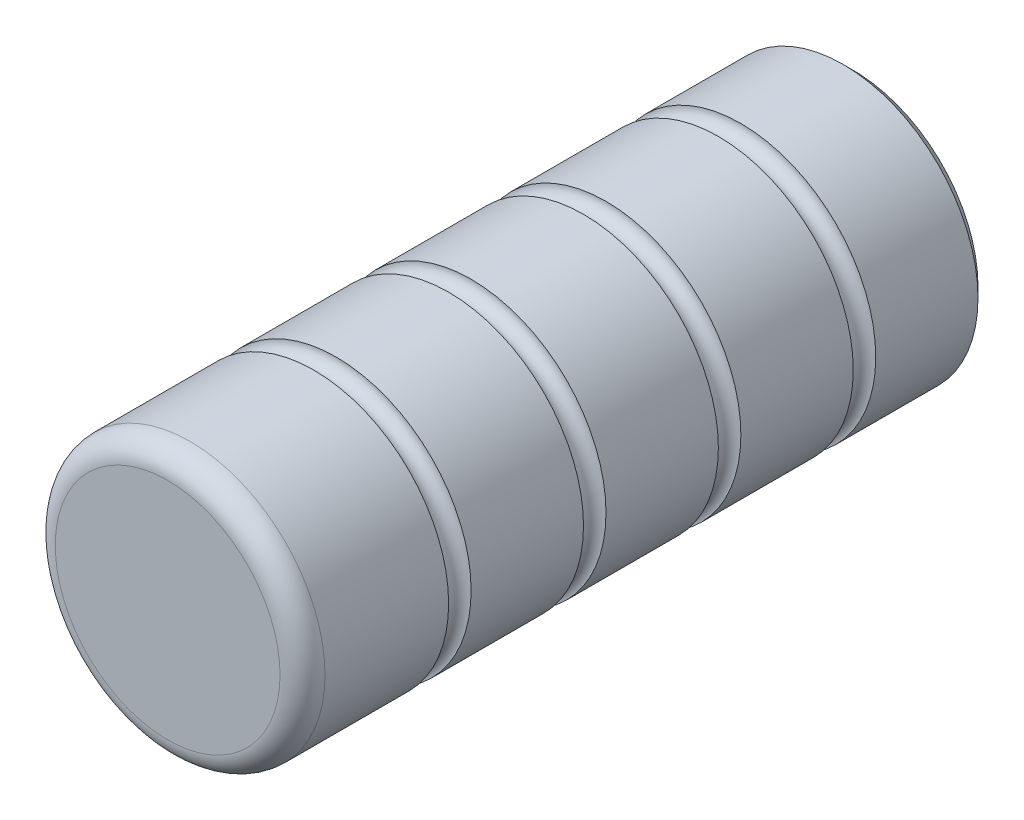
ISO-10303-21;
HEADER;
FILE_DESCRIPTION(('STEP AP214'),'2;1');
FILE_NAME('part.step','',(''),(''),'','','');
FILE_SCHEMA(('AUTOMOTIVE_DESIGN { 1 0 10303 214 1 1 1 1 }'));
ENDSEC;
DATA;
#1=APPLICATION_CONTEXT('core data for automotive mechanical design processes');
#2=APPLICATION_PROTOCOL_DEFINITION('international standard','automotive_design',2000,#1);
#3=PRODUCT_CONTEXT('',#1,'mechanical');
#4=PRODUCT('Part','Part','',(#3));
#5=PRODUCT_RELATED_PRODUCT_CATEGORY('part','',(#4));
#6=PRODUCT_DEFINITION_FORMATION('','',#4);
#7=PRODUCT_DEFINITION_CONTEXT('part definition',#1,'design');
#8=PRODUCT_DEFINITION('design','',#6,#7);
#9=PRODUCT_DEFINITION_SHAPE('','',#8);
#10=(LENGTH_UNIT() NAMED_UNIT(*) SI_UNIT(.MILLI.,.METRE.));
#11=(NAMED_UNIT(*) PLANE_ANGLE_UNIT() SI_UNIT($,.RADIAN.));
#12=(NAMED_UNIT(*) SI_UNIT($,.STERADIAN.) SOLID_ANGLE_UNIT());
#13=UNCERTAINTY_MEASURE_WITH_UNIT(LENGTH_MEASURE(1.E-05),#10,'distance_accuracy_value','');
#14=(GEOMETRIC_REPRESENTATION_CONTEXT(3) GLOBAL_UNCERTAINTY_ASSIGNED_CONTEXT((#13)) GLOBAL_UNIT_ASSIGNED_CONTEXT((#10,
#11,#12)) REPRESENTATION_CONTEXT('',''));
#15=CARTESIAN_POINT('',(0.,0.,0.));
#16=DIRECTION('',(0.,0.,1.));
#17=DIRECTION('',(1.,0.,0.));
#18=AXIS2_PLACEMENT_3D('',#15,#16,#17);
#19=CARTESIAN_POINT('',(0.,0.,30.5));
#20=DIRECTION('',(0.,0.,-1.));
#21=DIRECTION('',(-1.,0.,0.));
#22=AXIS2_PLACEMENT_3D('',#19,#20,#21);
#23=CYLINDRICAL_SURFACE('',#22,6.);
#24=CARTESIAN_POINT('',(0.,0.,0.45000000000002));
#25=DIRECTION('',(0.,0.,1.));
#26=DIRECTION('',(1.,0.,0.));
#27=AXIS2_PLACEMENT_3D('',#24,#25,#26);
#28=CIRCLE('',#27,6.);
#29=CARTESIAN_POINT('',(-6.,0.,0.450000000000016));
#30=VERTEX_POINT('',#29);
#31=EDGE_CURVE('E53',#30,#30,#28,.T.);
#32=CARTESIAN_POINT('',(0.,0.,5.));
#33=DIRECTION('',(0.,0.,1.));
#34=DIRECTION('',(1.,0.,0.));
#35=AXIS2_PLACEMENT_3D('',#32,#33,#34);
#36=CIRCLE('',#35,6.);
#37=CARTESIAN_POINT('',(-6.,0.,5.));
#38=VERTEX_POINT('',#37);
#39=EDGE_CURVE('E83',#38,#38,#36,.F.);
#40=CARTESIAN_POINT('',(-6.,0.,0.450000000000016));
#41=CARTESIAN_POINT('',(-6.,0.,0.497395833333349));
#42=CARTESIAN_POINT('',(-6.,0.,0.544791666666682));
#43=CARTESIAN_POINT('',(-6.,0.,0.639583333333348));
#44=CARTESIAN_POINT('',(-6.,0.,0.686979166666682));
#45=CARTESIAN_POINT('',(-6.,0.,0.781770833333349));
#46=CARTESIAN_POINT('',(-6.,0.,0.829166666666682));
#47=CARTESIAN_POINT('',(-6.,0.,0.923958333333348));
#48=CARTESIAN_POINT('',(-6.,0.,0.971354166666682));
#49=CARTESIAN_POINT('',(-6.,0.,1.06614583333335));
#50=CARTESIAN_POINT('',(-6.,0.,1.11354166666668));
#51=CARTESIAN_POINT('',(-6.,0.,1.20833333333335));
#52=CARTESIAN_POINT('',(-6.,0.,1.25572916666668));
#53=CARTESIAN_POINT('',(-6.,0.,1.35052083333335));
#54=CARTESIAN_POINT('',(-6.,0.,1.39791666666668));
#55=CARTESIAN_POINT('',(-6.,0.,1.49270833333335));
#56=CARTESIAN_POINT('',(-6.,0.,1.54010416666668));
#57=CARTESIAN_POINT('',(-6.,0.,1.63489583333335));
#58=CARTESIAN_POINT('',(-6.,0.,1.68229166666668));
#59=CARTESIAN_POINT('',(-6.,0.,1.77708333333334));
#60=CARTESIAN_POINT('',(-6.,0.,1.82447916666668));
#61=CARTESIAN_POINT('',(-6.,0.,1.91927083333335));
#62=CARTESIAN_POINT('',(-6.,0.,1.96666666666668));
#63=CARTESIAN_POINT('',(-6.,0.,2.06145833333334));
#64=CARTESIAN_POINT('',(-6.,0.,2.10885416666668));
#65=CARTESIAN_POINT('',(-6.,0.,2.20364583333334));
#66=CARTESIAN_POINT('',(-6.,0.,2.25104166666668));
#67=CARTESIAN_POINT('',(-6.,0.,2.34583333333334));
#68=CARTESIAN_POINT('',(-6.,0.,2.39322916666668));
#69=CARTESIAN_POINT('',(-6.,0.,2.48802083333334));
#70=CARTESIAN_POINT('',(-6.,0.,2.53541666666668));
#71=CARTESIAN_POINT('',(-6.,0.,2.63020833333334));
#72=CARTESIAN_POINT('',(-6.,0.,2.67760416666668));
#73=CARTESIAN_POINT('',(-6.,0.,2.77239583333334));
#74=CARTESIAN_POINT('',(-6.,0.,2.81979166666667));
#75=CARTESIAN_POINT('',(-6.,0.,2.91458333333334));
#76=CARTESIAN_POINT('',(-6.,0.,2.96197916666667));
#77=CARTESIAN_POINT('',(-6.,0.,3.05677083333334));
#78=CARTESIAN_POINT('',(-6.,0.,3.10416666666667));
#79=CARTESIAN_POINT('',(-6.,0.,3.19895833333334));
#80=CARTESIAN_POINT('',(-6.,0.,3.24635416666667));
#81=CARTESIAN_POINT('',(-6.,0.,3.34114583333334));
#82=CARTESIAN_POINT('',(-6.,0.,3.38854166666667));
#83=CARTESIAN_POINT('',(-6.,0.,3.48333333333334));
#84=CARTESIAN_POINT('',(-6.,0.,3.53072916666667));
#85=CARTESIAN_POINT('',(-6.,0.,3.62552083333334));
#86=CARTESIAN_POINT('',(-6.,0.,3.67291666666667));
#87=CARTESIAN_POINT('',(-6.,0.,3.76770833333334));
#88=CARTESIAN_POINT('',(-6.,0.,3.81510416666667));
#89=CARTESIAN_POINT('',(-6.,0.,3.90989583333334));
#90=CARTESIAN_POINT('',(-6.,0.,3.95729166666667));
#91=CARTESIAN_POINT('',(-6.,0.,4.05208333333334));
#92=CARTESIAN_POINT('',(-6.,0.,4.09947916666667));
#93=CARTESIAN_POINT('',(-6.,0.,4.19427083333334));
#94=CARTESIAN_POINT('',(-6.,0.,4.24166666666667));
#95=CARTESIAN_POINT('',(-6.,0.,4.33645833333334));
#96=CARTESIAN_POINT('',(-6.,0.,4.38385416666667));
#97=CARTESIAN_POINT('',(-6.,0.,4.47864583333333));
#98=CARTESIAN_POINT('',(-6.,0.,4.52604166666667));
#99=CARTESIAN_POINT('',(-6.,0.,4.62083333333334));
#100=CARTESIAN_POINT('',(-6.,0.,4.66822916666667));
#101=CARTESIAN_POINT('',(-6.,0.,4.76302083333333));
#102=CARTESIAN_POINT('',(-6.,0.,4.81041666666667));
#103=CARTESIAN_POINT('',(-6.,0.,4.90520833333333));
#104=CARTESIAN_POINT('',(-6.,0.,4.95260416666667));
#105=CARTESIAN_POINT('',(-6.,0.,5.));
#106=B_SPLINE_CURVE_WITH_KNOTS('',3,(#40,#41,#42,#43,#44,#45,#46,#47,#48,#49,#50,#51,#52,#53,
#54,#55,#56,#57,#58,#59,#60,#61,#62,#63,#64,#65,#66,#67,#68,#69,#70,#71,#72,#73,#74,#75,#76,#77,
#78,#79,#80,#81,#82,#83,#84,#85,#86,#87,#88,#89,#90,#91,#92,#93,#94,#95,#96,#97,#98,#99,#100,
#101,#102,#103,#104,#105),.UNSPECIFIED.,.F.,.F.,(4,2,2,2,2,2,2,2,2,2,2,2,2,2,2,2,2,2,2,2,2,2,2,
2,2,2,2,2,2,2,2,2,4),(0.,0.142187499999998,0.284375,0.426562499999998,0.56875,0.710937499999998,
0.853124999999996,0.995312499999998,1.1375,1.27968749999999,1.421875,1.56406249999999,
1.70624999999999,1.84843749999999,1.99062499999999,2.13281249999999,2.27499999999999,
2.41718749999999,2.55937499999999,2.70156249999999,2.84374999999999,2.98593749999999,
3.12812499999999,3.27031249999999,3.41249999999999,3.55468749999999,3.69687499999999,
3.83906249999999,3.98124999999998,4.12343749999999,4.26562499999998,4.40781249999998,
4.54999999999998),.UNSPECIFIED.);
#107=EDGE_CURVE('BSEAM44',#30,#38,#106,.T.);
#108=ORIENTED_EDGE('',*,*,#31,.T.);
#109=ORIENTED_EDGE('',*,*,#39,.T.);
#110=ORIENTED_EDGE('',*,*,#107,.T.);
#111=ORIENTED_EDGE('',*,*,#107,.F.);
#112=EDGE_LOOP('',(#108,#110,#109,#111));
#113=FACE_BOUND('',#112,.T.);
#114=ADVANCED_FACE('F44',(#113),#23,.T.);
#115=CARTESIAN_POINT('',(0.,0.,0.));
#116=DIRECTION('',(0.,0.,1.));
#117=DIRECTION('',(1.,0.,0.));
#118=AXIS2_PLACEMENT_3D('',#115,#116,#117);
#119=PLANE('',#118);
#120=CARTESIAN_POINT('',(0.,0.,0.));
#121=DIRECTION('',(0.,0.,1.));
#122=DIRECTION('',(1.,0.,0.));
#123=AXIS2_PLACEMENT_3D('',#120,#121,#122);
#124=CIRCLE('',#123,5.54999999999998);
#125=CARTESIAN_POINT('',(5.54999999999998,0.,0.));
#126=VERTEX_POINT('',#125);
#127=EDGE_CURVE('E10',#126,#126,#124,.F.);
#128=ORIENTED_EDGE('',*,*,#127,.T.);
#129=EDGE_LOOP('',(#128));
#130=FACE_BOUND('',#129,.T.);
#131=CARTESIAN_POINT('',(0.,0.,0.));
#132=DIRECTION('',(0.,0.,-1.));
#133=DIRECTION('',(-1.,0.,0.));
#134=AXIS2_PLACEMENT_3D('',#131,#132,#133);
#135=CIRCLE('',#134,3.175);
#136=CARTESIAN_POINT('',(-3.175,0.,0.));
#137=VERTEX_POINT('',#136);
#138=EDGE_CURVE('E70',#137,#137,#135,.T.);
#139=ORIENTED_EDGE('',*,*,#138,.F.);
#140=EDGE_LOOP('',(#139));
#141=FACE_BOUND('',#140,.T.);
#142=ADVANCED_FACE('F115',(#130,#141),#119,.F.);
#143=CARTESIAN_POINT('',(0.,0.,10.));
#144=DIRECTION('',(0.,0.,-1.));
#145=DIRECTION('',(-1.,0.,0.));
#146=AXIS2_PLACEMENT_3D('',#143,#144,#145);
#147=CYLINDRICAL_SURFACE('',#146,3.175);
#148=CARTESIAN_POINT('',(0.,0.,10.));
#149=DIRECTION('',(0.,0.,-1.));
#150=DIRECTION('',(-1.,0.,0.));
#151=AXIS2_PLACEMENT_3D('',#148,#149,#150);
#152=CIRCLE('',#151,3.175);
#153=CARTESIAN_POINT('',(-3.175,0.,10.));
#154=VERTEX_POINT('',#153);
#155=EDGE_CURVE('E102',#154,#154,#152,.T.);
#156=ORIENTED_EDGE('',*,*,#155,.F.);
#157=EDGE_LOOP('',(#156));
#158=FACE_BOUND('',#157,.T.);
#159=ORIENTED_EDGE('',*,*,#138,.T.);
#160=EDGE_LOOP('',(#159));
#161=FACE_BOUND('',#160,.T.);
#162=ADVANCED_FACE('F112',(#158,#161),#147,.F.);
#163=CARTESIAN_POINT('',(0.,0.,10.));
#164=DIRECTION('',(0.,0.,-1.));
#165=DIRECTION('',(-1.,0.,0.));
#166=AXIS2_PLACEMENT_3D('',#163,#164,#165);
#167=PLANE('',#166);
#168=ORIENTED_EDGE('',*,*,#155,.T.);
#169=EDGE_LOOP('',(#168));
#170=FACE_BOUND('',#169,.T.);
#171=ADVANCED_FACE('F110',(#170),#167,.T.);
#172=CARTESIAN_POINT('',(0.,0.,5.5));
#173=DIRECTION('',(0.,0.,-1.));
#174=DIRECTION('',(-1.,0.,0.));
#175=AXIS2_PLACEMENT_3D('',#172,#173,#174);
#176=TOROIDAL_SURFACE('',#175,6.,0.500000000000001);
#177=CARTESIAN_POINT('',(0.,0.,6.));
#178=DIRECTION('',(0.,0.,-1.));
#179=DIRECTION('',(-1.,0.,0.));
#180=AXIS2_PLACEMENT_3D('',#177,#178,#179);
#181=CIRCLE('',#180,6.);
#182=CARTESIAN_POINT('',(-6.,0.,6.));
#183=VERTEX_POINT('',#182);
#184=EDGE_CURVE('E87',#183,#183,#181,.F.);
#185=ORIENTED_EDGE('',*,*,#184,.F.);
#186=EDGE_LOOP('',(#185));
#187=FACE_BOUND('',#186,.T.);
#188=ORIENTED_EDGE('',*,*,#39,.F.);
#189=EDGE_LOOP('',(#188));
#190=FACE_BOUND('',#189,.T.);
#191=ADVANCED_FACE('F169',(#187,#190),#176,.F.);
#192=CARTESIAN_POINT('',(0.,0.,11.));
#193=DIRECTION('',(0.,0.,1.));
#194=DIRECTION('',(1.,0.,0.));
#195=AXIS2_PLACEMENT_3D('',#192,#193,#194);
#196=CIRCLE('',#195,6.);
#197=CARTESIAN_POINT('',(-6.,0.,11.));
#198=VERTEX_POINT('',#197);
#199=EDGE_CURVE('E75',#198,#198,#196,.F.);
#200=CARTESIAN_POINT('',(-6.,0.,11.));
#201=CARTESIAN_POINT('',(-6.,0.,10.9479166666667));
#202=CARTESIAN_POINT('',(-6.,0.,10.8958333333333));
#203=CARTESIAN_POINT('',(-6.,0.,10.7916666666667));
#204=CARTESIAN_POINT('',(-6.,0.,10.7395833333333));
#205=CARTESIAN_POINT('',(-6.,0.,10.6354166666667));
#206=CARTESIAN_POINT('',(-6.,0.,10.5833333333333));
#207=CARTESIAN_POINT('',(-6.,0.,10.4791666666667));
#208=CARTESIAN_POINT('',(-6.,0.,10.4270833333333));
#209=CARTESIAN_POINT('',(-6.,0.,10.3229166666667));
#210=CARTESIAN_POINT('',(-6.,0.,10.2708333333333));
#211=CARTESIAN_POINT('',(-6.,0.,10.1666666666667));
#212=CARTESIAN_POINT('',(-6.,0.,10.1145833333333));
#213=CARTESIAN_POINT('',(-6.,0.,10.0104166666667));
#214=CARTESIAN_POINT('',(-6.,0.,9.95833333333333));
#215=CARTESIAN_POINT('',(-6.,0.,9.85416666666667));
#216=CARTESIAN_POINT('',(-6.,0.,9.80208333333333));
#217=CARTESIAN_POINT('',(-6.,0.,9.69791666666667));
#218=CARTESIAN_POINT('',(-6.,0.,9.64583333333333));
#219=CARTESIAN_POINT('',(-6.,0.,9.54166666666667));
#220=CARTESIAN_POINT('',(-6.,0.,9.48958333333333));
#221=CARTESIAN_POINT('',(-6.,0.,9.38541666666667));
#222=CARTESIAN_POINT('',(-6.,0.,9.33333333333333));
#223=CARTESIAN_POINT('',(-6.,0.,9.22916666666667));
#224=CARTESIAN_POINT('',(-6.,0.,9.17708333333333));
#225=CARTESIAN_POINT('',(-6.,0.,9.07291666666667));
#226=CARTESIAN_POINT('',(-6.,0.,9.02083333333333));
#227=CARTESIAN_POINT('',(-6.,0.,8.91666666666667));
#228=CARTESIAN_POINT('',(-6.,0.,8.86458333333333));
#229=CARTESIAN_POINT('',(-6.,0.,8.76041666666667));
#230=CARTESIAN_POINT('',(-6.,0.,8.70833333333333));
#231=CARTESIAN_POINT('',(-6.,0.,8.60416666666667));
#232=CARTESIAN_POINT('',(-6.,0.,8.55208333333333));
#233=CARTESIAN_POINT('',(-6.,0.,8.44791666666667));
#234=CARTESIAN_POINT('',(-6.,0.,8.39583333333333));
#235=CARTESIAN_POINT('',(-6.,0.,8.29166666666667));
#236=CARTESIAN_POINT('',(-6.,0.,8.23958333333333));
#237=CARTESIAN_POINT('',(-6.,0.,8.13541666666667));
#238=CARTESIAN_POINT('',(-6.,0.,8.08333333333333));
#239=CARTESIAN_POINT('',(-6.,0.,7.97916666666667));
#240=CARTESIAN_POINT('',(-6.,0.,7.92708333333333));
#241=CARTESIAN_POINT('',(-6.,0.,7.82291666666667));
#242=CARTESIAN_POINT('',(-6.,0.,7.77083333333333));
#243=CARTESIAN_POINT('',(-6.,0.,7.66666666666667));
#244=CARTESIAN_POINT('',(-6.,0.,7.61458333333333));
#245=CARTESIAN_POINT('',(-6.,0.,7.51041666666667));
#246=CARTESIAN_POINT('',(-6.,0.,7.45833333333333));
#247=CARTESIAN_POINT('',(-6.,0.,7.35416666666667));
#248=CARTESIAN_POINT('',(-6.,0.,7.30208333333333));
#249=CARTESIAN_POINT('',(-6.,0.,7.19791666666667));
#250=CARTESIAN_POINT('',(-6.,0.,7.14583333333333));
#251=CARTESIAN_POINT('',(-6.,0.,7.04166666666667));
#252=CARTESIAN_POINT('',(-6.,0.,6.98958333333333));
#253=CARTESIAN_POINT('',(-6.,0.,6.88541666666667));
#254=CARTESIAN_POINT('',(-6.,0.,6.83333333333334));
#255=CARTESIAN_POINT('',(-6.,0.,6.72916666666667));
#256=CARTESIAN_POINT('',(-6.,0.,6.67708333333334));
#257=CARTESIAN_POINT('',(-6.,0.,6.57291666666667));
#258=CARTESIAN_POINT('',(-6.,0.,6.52083333333334));
#259=CARTESIAN_POINT('',(-6.,0.,6.41666666666667));
#260=CARTESIAN_POINT('',(-6.,0.,6.36458333333334));
#261=CARTESIAN_POINT('',(-6.,0.,6.26041666666667));
#262=CARTESIAN_POINT('',(-6.,0.,6.20833333333334));
#263=CARTESIAN_POINT('',(-6.,0.,6.10416666666667));
#264=CARTESIAN_POINT('',(-6.,0.,6.05208333333334));
#265=CARTESIAN_POINT('',(-6.,0.,6.));
#266=B_SPLINE_CURVE_WITH_KNOTS('',3,(#200,#201,#202,#203,#204,#205,#206,#207,#208,#209,#210,
#211,#212,#213,#214,#215,#216,#217,#218,#219,#220,#221,#222,#223,#224,#225,#226,#227,#228,#229,
#230,#231,#232,#233,#234,#235,#236,#237,#238,#239,#240,#241,#242,#243,#244,#245,#246,#247,#248,
#249,#250,#251,#252,#253,#254,#255,#256,#257,#258,#259,#260,#261,#262,#263,#264,#265),
.UNSPECIFIED.,.F.,.F.,(4,2,2,2,2,2,2,2,2,2,2,2,2,2,2,2,2,2,2,2,2,2,2,2,2,2,2,2,2,2,2,2,4),(0.,
0.15625,0.3125,0.46875,0.625000000000001,0.781250000000001,0.937500000000001,1.09375,1.25,
1.40625,1.5625,1.71875,1.875,2.03125,2.1875,2.34375,2.5,2.65625,2.8125,2.96875,3.125,3.28125,
3.4375,3.59375,3.75,3.90625,4.0625,4.21875,4.375,4.53125,4.6875,4.84375,5.),.UNSPECIFIED.);
#267=EDGE_CURVE('BSEAM127',#198,#183,#266,.T.);
#268=ORIENTED_EDGE('',*,*,#199,.T.);
#269=ORIENTED_EDGE('',*,*,#184,.T.);
#270=ORIENTED_EDGE('',*,*,#267,.T.);
#271=ORIENTED_EDGE('',*,*,#267,.F.);
#272=EDGE_LOOP('',(#268,#270,#269,#271));
#273=FACE_BOUND('',#272,.T.);
#274=ADVANCED_FACE('F127',(#273),#23,.T.);
#275=CARTESIAN_POINT('',(0.,0.,11.5));
#276=DIRECTION('',(0.,0.,-1.));
#277=DIRECTION('',(-1.,0.,0.));
#278=AXIS2_PLACEMENT_3D('',#275,#276,#277);
#279=TOROIDAL_SURFACE('',#278,6.,0.500000000000001);
#280=CARTESIAN_POINT('',(0.,0.,12.));
#281=DIRECTION('',(0.,0.,-1.));
#282=DIRECTION('',(-1.,0.,0.));
#283=AXIS2_PLACEMENT_3D('',#280,#281,#282);
#284=CIRCLE('',#283,6.);
#285=CARTESIAN_POINT('',(-6.,0.,12.));
#286=VERTEX_POINT('',#285);
#287=EDGE_CURVE('E79',#286,#286,#284,.F.);
#288=ORIENTED_EDGE('',*,*,#287,.F.);
#289=EDGE_LOOP('',(#288));
#290=FACE_BOUND('',#289,.T.);
#291=ORIENTED_EDGE('',*,*,#199,.F.);
#292=EDGE_LOOP('',(#291));
#293=FACE_BOUND('',#292,.T.);
#294=ADVANCED_FACE('F163',(#290,#293),#279,.F.);
#295=CARTESIAN_POINT('',(0.,0.,17.));
#296=DIRECTION('',(0.,0.,1.));
#297=DIRECTION('',(1.,0.,0.));
#298=AXIS2_PLACEMENT_3D('',#295,#296,#297);
#299=CIRCLE('',#298,6.);
#300=CARTESIAN_POINT('',(-6.,0.,17.));
#301=VERTEX_POINT('',#300);
#302=EDGE_CURVE('E91',#301,#301,#299,.F.);
#303=CARTESIAN_POINT('',(-6.,0.,12.));
#304=CARTESIAN_POINT('',(-6.,0.,12.0520833333333));
#305=CARTESIAN_POINT('',(-6.,0.,12.1041666666667));
#306=CARTESIAN_POINT('',(-6.,0.,12.2083333333333));
#307=CARTESIAN_POINT('',(-6.,0.,12.2604166666667));
#308=CARTESIAN_POINT('',(-6.,0.,12.3645833333333));
#309=CARTESIAN_POINT('',(-6.,0.,12.4166666666667));
#310=CARTESIAN_POINT('',(-6.,0.,12.5208333333333));
#311=CARTESIAN_POINT('',(-6.,0.,12.5729166666667));
#312=CARTESIAN_POINT('',(-6.,0.,12.6770833333333));
#313=CARTESIAN_POINT('',(-6.,0.,12.7291666666667));
#314=CARTESIAN_POINT('',(-6.,0.,12.8333333333333));
#315=CARTESIAN_POINT('',(-6.,0.,12.8854166666667));
#316=CARTESIAN_POINT('',(-6.,0.,12.9895833333333));
#317=CARTESIAN_POINT('',(-6.,0.,13.0416666666667));
#318=CARTESIAN_POINT('',(-6.,0.,13.1458333333333));
#319=CARTESIAN_POINT('',(-6.,0.,13.1979166666667));
#320=CARTESIAN_POINT('',(-6.,0.,13.3020833333333));
#321=CARTESIAN_POINT('',(-6.,0.,13.3541666666667));
#322=CARTESIAN_POINT('',(-6.,0.,13.4583333333333));
#323=CARTESIAN_POINT('',(-6.,0.,13.5104166666667));
#324=CARTESIAN_POINT('',(-6.,0.,13.6145833333333));
#325=CARTESIAN_POINT('',(-6.,0.,13.6666666666667));
#326=CARTESIAN_POINT('',(-6.,0.,13.7708333333333));
#327=CARTESIAN_POINT('',(-6.,0.,13.8229166666667));
#328=CARTESIAN_POINT('',(-6.,0.,13.9270833333333));
#329=CARTESIAN_POINT('',(-6.,0.,13.9791666666667));
#330=CARTESIAN_POINT('',(-6.,0.,14.0833333333333));
#331=CARTESIAN_POINT('',(-6.,0.,14.1354166666667));
#332=CARTESIAN_POINT('',(-6.,0.,14.2395833333333));
#333=CARTESIAN_POINT('',(-6.,0.,14.2916666666667));
#334=CARTESIAN_POINT('',(-6.,0.,14.3958333333333));
#335=CARTESIAN_POINT('',(-6.,0.,14.4479166666667));
#336=CARTESIAN_POINT('',(-6.,0.,14.5520833333333));
#337=CARTESIAN_POINT('',(-6.,0.,14.6041666666667));
#338=CARTESIAN_POINT('',(-6.,0.,14.7083333333333));
#339=CARTESIAN_POINT('',(-6.,0.,14.7604166666667));
#340=CARTESIAN_POINT('',(-6.,0.,14.8645833333333));
#341=CARTESIAN_POINT('',(-6.,0.,14.9166666666667));
#342=CARTESIAN_POINT('',(-6.,0.,15.0208333333333));
#343=CARTESIAN_POINT('',(-6.,0.,15.0729166666667));
#344=CARTESIAN_POINT('',(-6.,0.,15.1770833333333));
#345=CARTESIAN_POINT('',(-6.,0.,15.2291666666667));
#346=CARTESIAN_POINT('',(-6.,0.,15.3333333333333));
#347=CARTESIAN_POINT('',(-6.,0.,15.3854166666667));
#348=CARTESIAN_POINT('',(-6.,0.,15.4895833333333));
#349=CARTESIAN_POINT('',(-6.,0.,15.5416666666667));
#350=CARTESIAN_POINT('',(-6.,0.,15.6458333333333));
#351=CARTESIAN_POINT('',(-6.,0.,15.6979166666667));
#352=CARTESIAN_POINT('',(-6.,0.,15.8020833333333));
#353=CARTESIAN_POINT('',(-6.,0.,15.8541666666667));
#354=CARTESIAN_POINT('',(-6.,0.,15.9583333333333));
#355=CARTESIAN_POINT('',(-6.,0.,16.0104166666667));
#356=CARTESIAN_POINT('',(-6.,0.,16.1145833333333));
#357=CARTESIAN_POINT('',(-6.,0.,16.1666666666667));
#358=CARTESIAN_POINT('',(-6.,0.,16.2708333333333));
#359=CARTESIAN_POINT('',(-6.,0.,16.3229166666667));
#360=CARTESIAN_POINT('',(-6.,0.,16.4270833333333));
#361=CARTESIAN_POINT('',(-6.,0.,16.4791666666667));
#362=CARTESIAN_POINT('',(-6.,0.,16.5833333333333));
#363=CARTESIAN_POINT('',(-6.,0.,16.6354166666667));
#364=CARTESIAN_POINT('',(-6.,0.,16.7395833333333));
#365=CARTESIAN_POINT('',(-6.,0.,16.7916666666667));
#366=CARTESIAN_POINT('',(-6.,0.,16.8958333333333));
#367=CARTESIAN_POINT('',(-6.,0.,16.9479166666667));
#368=CARTESIAN_POINT('',(-6.,0.,17.));
#369=B_SPLINE_CURVE_WITH_KNOTS('',3,(#303,#304,#305,#306,#307,#308,#309,#310,#311,#312,#313,
#314,#315,#316,#317,#318,#319,#320,#321,#322,#323,#324,#325,#326,#327,#328,#329,#330,#331,#332,
#333,#334,#335,#336,#337,#338,#339,#340,#341,#342,#343,#344,#345,#346,#347,#348,#349,#350,#351,
#352,#353,#354,#355,#356,#357,#358,#359,#360,#361,#362,#363,#364,#365,#366,#367,#368),
.UNSPECIFIED.,.F.,.F.,(4,2,2,2,2,2,2,2,2,2,2,2,2,2,2,2,2,2,2,2,2,2,2,2,2,2,2,2,2,2,2,2,4),(0.,
0.15625,0.3125,0.46875,0.625000000000001,0.781250000000001,0.937500000000001,1.09375,1.25,
1.40625,1.5625,1.71875,1.875,2.03125,2.1875,2.34375,2.5,2.65625,2.8125,2.96875,3.125,3.28125,
3.4375,3.59375,3.75,3.90625,4.0625,4.21875,4.375,4.53125,4.6875,4.84375,5.),.UNSPECIFIED.);
#370=EDGE_CURVE('BSEAM126',#286,#301,#369,.T.);
#371=ORIENTED_EDGE('',*,*,#287,.T.);
#372=ORIENTED_EDGE('',*,*,#302,.T.);
#373=ORIENTED_EDGE('',*,*,#370,.T.);
#374=ORIENTED_EDGE('',*,*,#370,.F.);
#375=EDGE_LOOP('',(#371,#373,#372,#374));
#376=FACE_BOUND('',#375,.T.);
#377=ADVANCED_FACE('F126',(#376),#23,.T.);
#378=CARTESIAN_POINT('',(0.,0.,17.5));
#379=DIRECTION('',(0.,0.,-1.));
#380=DIRECTION('',(-1.,0.,0.));
#381=AXIS2_PLACEMENT_3D('',#378,#379,#380);
#382=TOROIDAL_SURFACE('',#381,6.,0.500000000000001);
#383=CARTESIAN_POINT('',(0.,0.,18.));
#384=DIRECTION('',(0.,0.,-1.));
#385=DIRECTION('',(-1.,0.,0.));
#386=AXIS2_PLACEMENT_3D('',#383,#384,#385);
#387=CIRCLE('',#386,6.);
#388=CARTESIAN_POINT('',(-6.,0.,18.));
#389=VERTEX_POINT('',#388);
#390=EDGE_CURVE('E95',#389,#389,#387,.F.);
#391=ORIENTED_EDGE('',*,*,#390,.F.);
#392=EDGE_LOOP('',(#391));
#393=FACE_BOUND('',#392,.T.);
#394=ORIENTED_EDGE('',*,*,#302,.F.);
#395=EDGE_LOOP('',(#394));
#396=FACE_BOUND('',#395,.T.);
#397=ADVANCED_FACE('F158',(#393,#396),#382,.F.);
#398=CARTESIAN_POINT('',(0.,0.,23.));
#399=DIRECTION('',(0.,0.,1.));
#400=DIRECTION('',(1.,0.,0.));
#401=AXIS2_PLACEMENT_3D('',#398,#399,#400);
#402=CIRCLE('',#401,6.);
#403=CARTESIAN_POINT('',(-6.,0.,23.));
#404=VERTEX_POINT('',#403);
#405=EDGE_CURVE('E66',#404,#404,#402,.F.);
#406=CARTESIAN_POINT('',(-6.,0.,23.));
#407=CARTESIAN_POINT('',(-6.,0.,22.9479166666667));
#408=CARTESIAN_POINT('',(-6.,0.,22.8958333333333));
#409=CARTESIAN_POINT('',(-6.,0.,22.7916666666667));
#410=CARTESIAN_POINT('',(-6.,0.,22.7395833333333));
#411=CARTESIAN_POINT('',(-6.,0.,22.6354166666667));
#412=CARTESIAN_POINT('',(-6.,0.,22.5833333333333));
#413=CARTESIAN_POINT('',(-6.,0.,22.4791666666667));
#414=CARTESIAN_POINT('',(-6.,0.,22.4270833333333));
#415=CARTESIAN_POINT('',(-6.,0.,22.3229166666667));
#416=CARTESIAN_POINT('',(-6.,0.,22.2708333333333));
#417=CARTESIAN_POINT('',(-6.,0.,22.1666666666667));
#418=CARTESIAN_POINT('',(-6.,0.,22.1145833333333));
#419=CARTESIAN_POINT('',(-6.,0.,22.0104166666667));
#420=CARTESIAN_POINT('',(-6.,0.,21.9583333333333));
#421=CARTESIAN_POINT('',(-6.,0.,21.8541666666667));
#422=CARTESIAN_POINT('',(-6.,0.,21.8020833333333));
#423=CARTESIAN_POINT('',(-6.,0.,21.6979166666667));
#424=CARTESIAN_POINT('',(-6.,0.,21.6458333333333));
#425=CARTESIAN_POINT('',(-6.,0.,21.5416666666667));
#426=CARTESIAN_POINT('',(-6.,0.,21.4895833333333));
#427=CARTESIAN_POINT('',(-6.,0.,21.3854166666667));
#428=CARTESIAN_POINT('',(-6.,0.,21.3333333333333));
#429=CARTESIAN_POINT('',(-6.,0.,21.2291666666667));
#430=CARTESIAN_POINT('',(-6.,0.,21.1770833333333));
#431=CARTESIAN_POINT('',(-6.,0.,21.0729166666667));
#432=CARTESIAN_POINT('',(-6.,0.,21.0208333333333));
#433=CARTESIAN_POINT('',(-6.,0.,20.9166666666667));
#434=CARTESIAN_POINT('',(-6.,0.,20.8645833333333));
#435=CARTESIAN_POINT('',(-6.,0.,20.7604166666667));
#436=CARTESIAN_POINT('',(-6.,0.,20.7083333333333));
#437=CARTESIAN_POINT('',(-6.,0.,20.6041666666667));
#438=CARTESIAN_POINT('',(-6.,0.,20.5520833333333));
#439=CARTESIAN_POINT('',(-6.,0.,20.4479166666667));
#440=CARTESIAN_POINT('',(-6.,0.,20.3958333333333));
#441=CARTESIAN_POINT('',(-6.,0.,20.2916666666667));
#442=CARTESIAN_POINT('',(-6.,0.,20.2395833333333));
#443=CARTESIAN_POINT('',(-6.,0.,20.1354166666667));
#444=CARTESIAN_POINT('',(-6.,0.,20.0833333333333));
#445=CARTESIAN_POINT('',(-6.,0.,19.9791666666667));
#446=CARTESIAN_POINT('',(-6.,0.,19.9270833333333));
#447=CARTESIAN_POINT('',(-6.,0.,19.8229166666667));
#448=CARTESIAN_POINT('',(-6.,0.,19.7708333333333));
#449=CARTESIAN_POINT('',(-6.,0.,19.6666666666667));
#450=CARTESIAN_POINT('',(-6.,0.,19.6145833333333));
#451=CARTESIAN_POINT('',(-6.,0.,19.5104166666667));
#452=CARTESIAN_POINT('',(-6.,0.,19.4583333333333));
#453=CARTESIAN_POINT('',(-6.,0.,19.3541666666667));
#454=CARTESIAN_POINT('',(-6.,0.,19.3020833333333));
#455=CARTESIAN_POINT('',(-6.,0.,19.1979166666667));
#456=CARTESIAN_POINT('',(-6.,0.,19.1458333333333));
#457=CARTESIAN_POINT('',(-6.,0.,19.0416666666667));
#458=CARTESIAN_POINT('',(-6.,0.,18.9895833333333));
#459=CARTESIAN_POINT('',(-6.,0.,18.8854166666667));
#460=CARTESIAN_POINT('',(-6.,0.,18.8333333333333));
#461=CARTESIAN_POINT('',(-6.,0.,18.7291666666667));
#462=CARTESIAN_POINT('',(-6.,0.,18.6770833333333));
#463=CARTESIAN_POINT('',(-6.,0.,18.5729166666667));
#464=CARTESIAN_POINT('',(-6.,0.,18.5208333333333));
#465=CARTESIAN_POINT('',(-6.,0.,18.4166666666667));
#466=CARTESIAN_POINT('',(-6.,0.,18.3645833333333));
#467=CARTESIAN_POINT('',(-6.,0.,18.2604166666667));
#468=CARTESIAN_POINT('',(-6.,0.,18.2083333333333));
#469=CARTESIAN_POINT('',(-6.,0.,18.1041666666667));
#470=CARTESIAN_POINT('',(-6.,0.,18.0520833333333));
#471=CARTESIAN_POINT('',(-6.,0.,18.));
#472=B_SPLINE_CURVE_WITH_KNOTS('',3,(#406,#407,#408,#409,#410,#411,#412,#413,#414,#415,#416,
#417,#418,#419,#420,#421,#422,#423,#424,#425,#426,#427,#428,#429,#430,#431,#432,#433,#434,#435,
#436,#437,#438,#439,#440,#441,#442,#443,#444,#445,#446,#447,#448,#449,#450,#451,#452,#453,#454,
#455,#456,#457,#458,#459,#460,#461,#462,#463,#464,#465,#466,#467,#468,#469,#470,#471),
.UNSPECIFIED.,.F.,.F.,(4,2,2,2,2,2,2,2,2,2,2,2,2,2,2,2,2,2,2,2,2,2,2,2,2,2,2,2,2,2,2,2,4),(0.,
0.15625,0.312499999999997,0.468749999999997,0.624999999999997,0.781249999999997,
0.937499999999997,1.09375,1.25,1.40624999999999,1.5625,1.71874999999999,1.875,2.03124999999999,
2.1875,2.34375,2.5,2.65625,2.81249999999999,2.96875,3.12499999999999,3.28125,3.43749999999999,
3.59375,3.74999999999999,3.90624999999999,4.06249999999999,4.21874999999999,4.37499999999999,
4.53124999999999,4.68749999999999,4.84374999999999,4.99999999999999),.UNSPECIFIED.);
#473=EDGE_CURVE('BSEAM134',#404,#389,#472,.T.);
#474=ORIENTED_EDGE('',*,*,#405,.T.);
#475=ORIENTED_EDGE('',*,*,#390,.T.);
#476=ORIENTED_EDGE('',*,*,#473,.T.);
#477=ORIENTED_EDGE('',*,*,#473,.F.);
#478=EDGE_LOOP('',(#474,#476,#475,#477));
#479=FACE_BOUND('',#478,.T.);
#480=ADVANCED_FACE('F134',(#479),#23,.T.);
#481=CARTESIAN_POINT('',(0.,0.,23.5));
#482=DIRECTION('',(0.,0.,-1.));
#483=DIRECTION('',(-1.,0.,0.));
#484=AXIS2_PLACEMENT_3D('',#481,#482,#483);
#485=TOROIDAL_SURFACE('',#484,6.,0.500000000000001);
#486=CARTESIAN_POINT('',(0.,0.,24.));
#487=DIRECTION('',(0.,0.,-1.));
#488=DIRECTION('',(-1.,0.,0.));
#489=AXIS2_PLACEMENT_3D('',#486,#487,#488);
#490=CIRCLE('',#489,6.);
#491=CARTESIAN_POINT('',(-6.,0.,24.));
#492=VERTEX_POINT('',#491);
#493=EDGE_CURVE('E71',#492,#492,#490,.F.);
#494=ORIENTED_EDGE('',*,*,#493,.F.);
#495=EDGE_LOOP('',(#494));
#496=FACE_BOUND('',#495,.T.);
#497=ORIENTED_EDGE('',*,*,#405,.F.);
#498=EDGE_LOOP('',(#497));
#499=FACE_BOUND('',#498,.T.);
#500=ADVANCED_FACE('F142',(#496,#499),#485,.F.);
#501=CARTESIAN_POINT('',(0.,0.,30.5));
#502=DIRECTION('',(0.,0.,1.));
#503=DIRECTION('',(1.,0.,0.));
#504=AXIS2_PLACEMENT_3D('',#501,#502,#503);
#505=PLANE('',#504);
#506=CARTESIAN_POINT('',(0.,0.,30.5));
#507=DIRECTION('',(0.,0.,1.));
#508=DIRECTION('',(1.,0.,0.));
#509=AXIS2_PLACEMENT_3D('',#506,#507,#508);
#510=CIRCLE('',#509,5.);
#511=CARTESIAN_POINT('',(5.,0.,30.5));
#512=VERTEX_POINT('',#511);
#513=EDGE_CURVE('E63',#512,#512,#510,.T.);
#514=ORIENTED_EDGE('',*,*,#513,.T.);
#515=EDGE_LOOP('',(#514));
#516=FACE_BOUND('',#515,.T.);
#517=ADVANCED_FACE('F129',(#516),#505,.T.);
#518=CARTESIAN_POINT('',(0.,0.,29.5));
#519=DIRECTION('',(0.,0.,1.));
#520=DIRECTION('',(1.,0.,0.));
#521=AXIS2_PLACEMENT_3D('',#518,#519,#520);
#522=TOROIDAL_SURFACE('',#521,5.,1.);
#523=CARTESIAN_POINT('',(0.,0.,29.5));
#524=DIRECTION('',(0.,0.,1.));
#525=DIRECTION('',(1.,0.,0.));
#526=AXIS2_PLACEMENT_3D('',#523,#524,#525);
#527=CIRCLE('',#526,6.);
#528=CARTESIAN_POINT('',(-6.,0.,29.5));
#529=VERTEX_POINT('',#528);
#530=EDGE_CURVE('E58',#529,#529,#527,.F.);
#531=ORIENTED_EDGE('',*,*,#530,.F.);
#532=EDGE_LOOP('',(#531));
#533=FACE_BOUND('',#532,.T.);
#534=ORIENTED_EDGE('',*,*,#513,.F.);
#535=EDGE_LOOP('',(#534));
#536=FACE_BOUND('',#535,.T.);
#537=ADVANCED_FACE('F132',(#533,#536),#522,.T.);
#538=CARTESIAN_POINT('',(-6.,0.,24.));
#539=CARTESIAN_POINT('',(-6.,0.,24.0572916666667));
#540=CARTESIAN_POINT('',(-6.,0.,24.1145833333333));
#541=CARTESIAN_POINT('',(-6.,0.,24.2291666666667));
#542=CARTESIAN_POINT('',(-6.,0.,24.2864583333333));
#543=CARTESIAN_POINT('',(-6.,0.,24.4010416666667));
#544=CARTESIAN_POINT('',(-6.,0.,24.4583333333333));
#545=CARTESIAN_POINT('',(-6.,0.,24.5729166666667));
#546=CARTESIAN_POINT('',(-6.,0.,24.6302083333333));
#547=CARTESIAN_POINT('',(-6.,0.,24.7447916666667));
#548=CARTESIAN_POINT('',(-6.,0.,24.8020833333333));
#549=CARTESIAN_POINT('',(-6.,0.,24.9166666666667));
#550=CARTESIAN_POINT('',(-6.,0.,24.9739583333333));
#551=CARTESIAN_POINT('',(-6.,0.,25.0885416666667));
#552=CARTESIAN_POINT('',(-6.,0.,25.1458333333333));
#553=CARTESIAN_POINT('',(-6.,0.,25.2604166666667));
#554=CARTESIAN_POINT('',(-6.,0.,25.3177083333333));
#555=CARTESIAN_POINT('',(-6.,0.,25.4322916666667));
#556=CARTESIAN_POINT('',(-6.,0.,25.4895833333333));
#557=CARTESIAN_POINT('',(-6.,0.,25.6041666666667));
#558=CARTESIAN_POINT('',(-6.,0.,25.6614583333333));
#559=CARTESIAN_POINT('',(-6.,0.,25.7760416666667));
#560=CARTESIAN_POINT('',(-6.,0.,25.8333333333333));
#561=CARTESIAN_POINT('',(-6.,0.,25.9479166666667));
#562=CARTESIAN_POINT('',(-6.,0.,26.0052083333333));
#563=CARTESIAN_POINT('',(-6.,0.,26.1197916666667));
#564=CARTESIAN_POINT('',(-6.,0.,26.1770833333333));
#565=CARTESIAN_POINT('',(-6.,0.,26.2916666666667));
#566=CARTESIAN_POINT('',(-6.,0.,26.3489583333333));
#567=CARTESIAN_POINT('',(-6.,0.,26.4635416666667));
#568=CARTESIAN_POINT('',(-6.,0.,26.5208333333333));
#569=CARTESIAN_POINT('',(-6.,0.,26.6354166666667));
#570=CARTESIAN_POINT('',(-6.,0.,26.6927083333333));
#571=CARTESIAN_POINT('',(-6.,0.,26.8072916666667));
#572=CARTESIAN_POINT('',(-6.,0.,26.8645833333333));
#573=CARTESIAN_POINT('',(-6.,0.,26.9791666666667));
#574=CARTESIAN_POINT('',(-6.,0.,27.0364583333333));
#575=CARTESIAN_POINT('',(-6.,0.,27.1510416666667));
#576=CARTESIAN_POINT('',(-6.,0.,27.2083333333333));
#577=CARTESIAN_POINT('',(-6.,0.,27.3229166666667));
#578=CARTESIAN_POINT('',(-6.,0.,27.3802083333333));
#579=CARTESIAN_POINT('',(-6.,0.,27.4947916666667));
#580=CARTESIAN_POINT('',(-6.,0.,27.5520833333333));
#581=CARTESIAN_POINT('',(-6.,0.,27.6666666666667));
#582=CARTESIAN_POINT('',(-6.,0.,27.7239583333333));
#583=CARTESIAN_POINT('',(-6.,0.,27.8385416666667));
#584=CARTESIAN_POINT('',(-6.,0.,27.8958333333333));
#585=CARTESIAN_POINT('',(-6.,0.,28.0104166666667));
#586=CARTESIAN_POINT('',(-6.,0.,28.0677083333333));
#587=CARTESIAN_POINT('',(-6.,0.,28.1822916666667));
#588=CARTESIAN_POINT('',(-6.,0.,28.2395833333333));
#589=CARTESIAN_POINT('',(-6.,0.,28.3541666666667));
#590=CARTESIAN_POINT('',(-6.,0.,28.4114583333333));
#591=CARTESIAN_POINT('',(-6.,0.,28.5260416666667));
#592=CARTESIAN_POINT('',(-6.,0.,28.5833333333333));
#593=CARTESIAN_POINT('',(-6.,0.,28.6979166666667));
#594=CARTESIAN_POINT('',(-6.,0.,28.7552083333333));
#595=CARTESIAN_POINT('',(-6.,0.,28.8697916666667));
#596=CARTESIAN_POINT('',(-6.,0.,28.9270833333333));
#597=CARTESIAN_POINT('',(-6.,0.,29.0416666666667));
#598=CARTESIAN_POINT('',(-6.,0.,29.0989583333333));
#599=CARTESIAN_POINT('',(-6.,0.,29.2135416666667));
#600=CARTESIAN_POINT('',(-6.,0.,29.2708333333333));
#601=CARTESIAN_POINT('',(-6.,0.,29.3854166666667));
#602=CARTESIAN_POINT('',(-6.,0.,29.4427083333333));
#603=CARTESIAN_POINT('',(-6.,0.,29.5));
#604=B_SPLINE_CURVE_WITH_KNOTS('',3,(#538,#539,#540,#541,#542,#543,#544,#545,#546,#547,#548,
#549,#550,#551,#552,#553,#554,#555,#556,#557,#558,#559,#560,#561,#562,#563,#564,#565,#566,#567,
#568,#569,#570,#571,#572,#573,#574,#575,#576,#577,#578,#579,#580,#581,#582,#583,#584,#585,#586,
#587,#588,#589,#590,#591,#592,#593,#594,#595,#596,#597,#598,#599,#600,#601,#602,#603),
.UNSPECIFIED.,.F.,.F.,(4,2,2,2,2,2,2,2,2,2,2,2,2,2,2,2,2,2,2,2,2,2,2,2,2,2,2,2,2,2,2,2,4),(0.,
0.171874999999998,0.34375,0.515624999999999,0.687499999999997,0.859374999999999,1.03125,
1.203125,1.375,1.546875,1.71875,1.890625,2.0625,2.234375,2.40625,2.578125,2.75,2.92187499999999,
3.09375,3.26562499999999,3.4375,3.60937499999999,3.78125,3.95312499999999,4.12499999999999,
4.296875,4.46874999999999,4.640625,4.81249999999999,4.98437499999999,5.15624999999999,
5.32812499999999,5.49999999999999),.UNSPECIFIED.);
#605=EDGE_CURVE('BSEAM130',#492,#529,#604,.T.);
#606=ORIENTED_EDGE('',*,*,#493,.T.);
#607=ORIENTED_EDGE('',*,*,#530,.T.);
#608=ORIENTED_EDGE('',*,*,#605,.T.);
#609=ORIENTED_EDGE('',*,*,#605,.F.);
#610=EDGE_LOOP('',(#606,#608,#607,#609));
#611=FACE_BOUND('',#610,.T.);
#612=ADVANCED_FACE('F130',(#611),#23,.T.);
#613=CARTESIAN_POINT('',(0.,0.,0.45000000000002));
#614=DIRECTION('',(0.,0.,1.));
#615=DIRECTION('',(1.,0.,0.));
#616=AXIS2_PLACEMENT_3D('',#613,#614,#615);
#617=CONICAL_SURFACE('',#616,6.,0.785398163397446);
#618=ORIENTED_EDGE('',*,*,#127,.F.);
#619=EDGE_LOOP('',(#618));
#620=FACE_BOUND('',#619,.T.);
#621=ORIENTED_EDGE('',*,*,#31,.F.);
#622=EDGE_LOOP('',(#621));
#623=FACE_BOUND('',#622,.T.);
#624=ADVANCED_FACE('F47',(#620,#623),#617,.T.);
#625=CLOSED_SHELL('',(#114,#142,#162,#171,#191,#274,#294,#377,#397,#480,#500,#517,#537,#612,#624));
#626=MANIFOLD_SOLID_BREP('B2',#625);
#627=ADVANCED_BREP_SHAPE_REPRESENTATION('',(#18,#626),#14);
#628=SHAPE_DEFINITION_REPRESENTATION(#9,#627);
ENDSEC;
END-ISO-10303-21;
